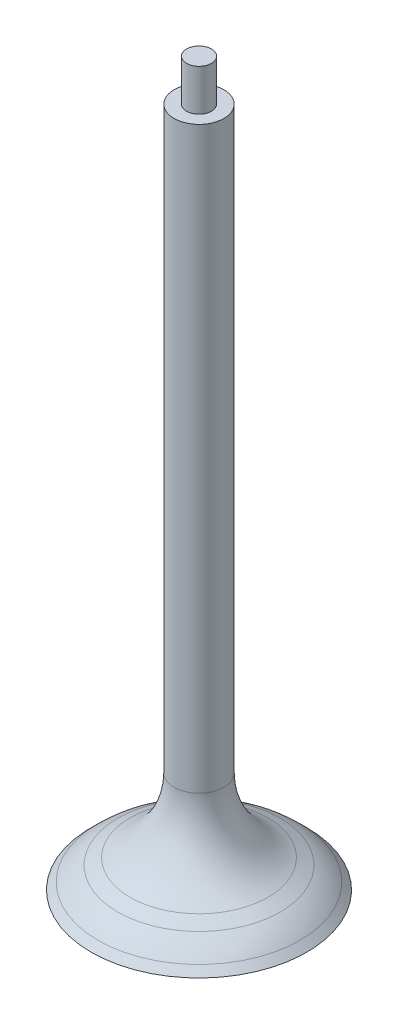
ISO-10303-21;
HEADER;
FILE_DESCRIPTION(('STEP AP214'),'2;1');
FILE_NAME('part.step','',(''),(''),'','','');
FILE_SCHEMA(('AUTOMOTIVE_DESIGN { 1 0 10303 214 1 1 1 1 }'));
ENDSEC;
DATA;
#1=APPLICATION_CONTEXT('core data for automotive mechanical design processes');
#2=APPLICATION_PROTOCOL_DEFINITION('international standard','automotive_design',2000,#1);
#3=PRODUCT_CONTEXT('',#1,'mechanical');
#4=PRODUCT('Part','Part','',(#3));
#5=PRODUCT_RELATED_PRODUCT_CATEGORY('part','',(#4));
#6=PRODUCT_DEFINITION_FORMATION('','',#4);
#7=PRODUCT_DEFINITION_CONTEXT('part definition',#1,'design');
#8=PRODUCT_DEFINITION('design','',#6,#7);
#9=PRODUCT_DEFINITION_SHAPE('','',#8);
#10=(LENGTH_UNIT() NAMED_UNIT(*) SI_UNIT(.MILLI.,.METRE.));
#11=(NAMED_UNIT(*) PLANE_ANGLE_UNIT() SI_UNIT($,.RADIAN.));
#12=(NAMED_UNIT(*) SI_UNIT($,.STERADIAN.) SOLID_ANGLE_UNIT());
#13=UNCERTAINTY_MEASURE_WITH_UNIT(LENGTH_MEASURE(1.E-05),#10,'distance_accuracy_value','');
#14=(GEOMETRIC_REPRESENTATION_CONTEXT(3) GLOBAL_UNCERTAINTY_ASSIGNED_CONTEXT((#13)) GLOBAL_UNIT_ASSIGNED_CONTEXT((#10,
#11,#12)) REPRESENTATION_CONTEXT('',''));
#15=CARTESIAN_POINT('',(0.,0.,0.));
#16=DIRECTION('',(0.,0.,1.));
#17=DIRECTION('',(1.,0.,0.));
#18=AXIS2_PLACEMENT_3D('',#15,#16,#17);
#19=CARTESIAN_POINT('',(13.,0.,0.));
#20=DIRECTION('',(0.,-1.,0.));
#21=DIRECTION('',(0.,0.,-1.));
#22=AXIS2_PLACEMENT_3D('',#19,#20,#21);
#23=PLANE('',#22);
#24=CARTESIAN_POINT('',(0.,0.,0.));
#25=DIRECTION('',(0.,-1.,0.));
#26=DIRECTION('',(0.,0.,-1.));
#27=AXIS2_PLACEMENT_3D('',#24,#25,#26);
#28=CIRCLE('',#27,13.);
#29=CARTESIAN_POINT('',(0.,0.,-13.));
#30=VERTEX_POINT('',#29);
#31=EDGE_CURVE('E62',#30,#30,#28,.T.);
#32=ORIENTED_EDGE('',*,*,#31,.T.);
#33=EDGE_LOOP('',(#32));
#34=FACE_BOUND('',#33,.T.);
#35=ADVANCED_FACE('F33',(#34),#23,.T.);
#36=CARTESIAN_POINT('',(0.,87.,0.));
#37=DIRECTION('',(0.,1.,0.));
#38=DIRECTION('',(0.,0.,1.));
#39=AXIS2_PLACEMENT_3D('',#36,#37,#38);
#40=PLANE('',#39);
#41=CARTESIAN_POINT('',(0.,87.,0.));
#42=DIRECTION('',(0.,-1.,0.));
#43=DIRECTION('',(0.,0.,-1.));
#44=AXIS2_PLACEMENT_3D('',#41,#42,#43);
#45=CIRCLE('',#44,1.5);
#46=CARTESIAN_POINT('',(0.,87.,-1.5));
#47=VERTEX_POINT('',#46);
#48=EDGE_CURVE('E53',#47,#47,#45,.T.);
#49=ORIENTED_EDGE('',*,*,#48,.F.);
#50=EDGE_LOOP('',(#49));
#51=FACE_BOUND('',#50,.T.);
#52=ADVANCED_FACE('F80',(#51),#40,.T.);
#53=CARTESIAN_POINT('',(0.,0.,0.));
#54=DIRECTION('',(0.,-1.,0.));
#55=DIRECTION('',(0.,0.,-1.));
#56=AXIS2_PLACEMENT_3D('',#53,#54,#55);
#57=CYLINDRICAL_SURFACE('',#56,1.5);
#58=ORIENTED_EDGE('',*,*,#48,.T.);
#59=EDGE_LOOP('',(#58));
#60=FACE_BOUND('',#59,.T.);
#61=CARTESIAN_POINT('',(0.,82.,0.));
#62=DIRECTION('',(0.,-1.,0.));
#63=DIRECTION('',(0.,0.,-1.));
#64=AXIS2_PLACEMENT_3D('',#61,#62,#63);
#65=CIRCLE('',#64,1.5);
#66=CARTESIAN_POINT('',(0.,82.,-1.5));
#67=VERTEX_POINT('',#66);
#68=EDGE_CURVE('E56',#67,#67,#65,.T.);
#69=ORIENTED_EDGE('',*,*,#68,.F.);
#70=EDGE_LOOP('',(#69));
#71=FACE_BOUND('',#70,.T.);
#72=ADVANCED_FACE('F85',(#60,#71),#57,.T.);
#73=CARTESIAN_POINT('',(1.5,82.,0.));
#74=DIRECTION('',(0.,1.,0.));
#75=DIRECTION('',(0.,0.,1.));
#76=AXIS2_PLACEMENT_3D('',#73,#74,#75);
#77=PLANE('',#76);
#78=ORIENTED_EDGE('',*,*,#68,.T.);
#79=EDGE_LOOP('',(#78));
#80=FACE_BOUND('',#79,.T.);
#81=CARTESIAN_POINT('',(0.,82.,0.));
#82=DIRECTION('',(0.,-1.,0.));
#83=DIRECTION('',(0.,0.,-1.));
#84=AXIS2_PLACEMENT_3D('',#81,#82,#83);
#85=CIRCLE('',#84,3.);
#86=CARTESIAN_POINT('',(0.,82.,-3.));
#87=VERTEX_POINT('',#86);
#88=EDGE_CURVE('E59',#87,#87,#85,.T.);
#89=ORIENTED_EDGE('',*,*,#88,.F.);
#90=EDGE_LOOP('',(#89));
#91=FACE_BOUND('',#90,.T.);
#92=ADVANCED_FACE('F91',(#80,#91),#77,.T.);
#93=CARTESIAN_POINT('',(0.,0.,0.));
#94=DIRECTION('',(0.,-1.,0.));
#95=DIRECTION('',(0.,0.,-1.));
#96=AXIS2_PLACEMENT_3D('',#93,#94,#95);
#97=CYLINDRICAL_SURFACE('',#96,3.);
#98=CARTESIAN_POINT('',(0.,12.2086061902756,0.));
#99=DIRECTION('',(0.,-1.,0.));
#100=DIRECTION('',(0.,0.,-1.));
#101=AXIS2_PLACEMENT_3D('',#98,#99,#100);
#102=CIRCLE('',#101,3.);
#103=CARTESIAN_POINT('',(0.,12.2086061902756,-3.));
#104=VERTEX_POINT('',#103);
#105=EDGE_CURVE('E44',#104,#104,#102,.F.);
#106=ORIENTED_EDGE('',*,*,#105,.T.);
#107=EDGE_LOOP('',(#106));
#108=FACE_BOUND('',#107,.T.);
#109=ORIENTED_EDGE('',*,*,#88,.T.);
#110=EDGE_LOOP('',(#109));
#111=FACE_BOUND('',#110,.T.);
#112=ADVANCED_FACE('F77',(#108,#111),#97,.T.);
#113=CARTESIAN_POINT('',(0.,1.88538002488021,0.));
#114=DIRECTION('',(0.,-1.,0.));
#115=DIRECTION('',(0.,0.,-1.));
#116=AXIS2_PLACEMENT_3D('',#113,#114,#115);
#117=CONICAL_SURFACE('',#116,11.1146199751198,1.08210413623649);
#118=CARTESIAN_POINT('',(0.,2.58700997651313,0.));
#119=DIRECTION('',(0.,1.,0.));
#120=DIRECTION('',(0.,0.,1.));
#121=AXIS2_PLACEMENT_3D('',#118,#119,#120);
#122=CIRCLE('',#121,9.79504595620407);
#123=CARTESIAN_POINT('',(0.,2.58700997651313,9.79504595620407));
#124=VERTEX_POINT('',#123);
#125=EDGE_CURVE('E10',#124,#124,#122,.T.);
#126=ORIENTED_EDGE('',*,*,#125,.T.);
#127=EDGE_LOOP('',(#126));
#128=FACE_BOUND('',#127,.T.);
#129=CARTESIAN_POINT('',(0.,3.37913026168634,0.));
#130=DIRECTION('',(0.,-1.,0.));
#131=DIRECTION('',(0.,0.,-1.));
#132=AXIS2_PLACEMENT_3D('',#129,#130,#131);
#133=CIRCLE('',#132,8.30528437214112);
#134=CARTESIAN_POINT('',(0.,3.37913026168634,-8.30528437214112));
#135=VERTEX_POINT('',#134);
#136=EDGE_CURVE('E48',#135,#135,#133,.T.);
#137=ORIENTED_EDGE('',*,*,#136,.T.);
#138=EDGE_LOOP('',(#137));
#139=FACE_BOUND('',#138,.T.);
#140=ADVANCED_FACE('F70',(#128,#139),#117,.T.);
#141=CARTESIAN_POINT('',(0.,0.,0.));
#142=DIRECTION('',(0.,-1.,0.));
#143=DIRECTION('',(0.,0.,-1.));
#144=AXIS2_PLACEMENT_3D('',#141,#142,#143);
#145=CONICAL_SURFACE('',#144,13.,0.785398163397451);
#146=CARTESIAN_POINT('',(0.,0.828601859789346,0.));
#147=DIRECTION('',(0.,1.,0.));
#148=DIRECTION('',(0.,0.,1.));
#149=AXIS2_PLACEMENT_3D('',#146,#147,#148);
#150=CIRCLE('',#149,12.1713981402106);
#151=CARTESIAN_POINT('',(0.,0.828601859789346,12.1713981402106));
#152=VERTEX_POINT('',#151);
#153=EDGE_CURVE('E40',#152,#152,#150,.F.);
#154=ORIENTED_EDGE('',*,*,#153,.T.);
#155=EDGE_LOOP('',(#154));
#156=FACE_BOUND('',#155,.T.);
#157=ORIENTED_EDGE('',*,*,#31,.F.);
#158=EDGE_LOOP('',(#157));
#159=FACE_BOUND('',#158,.T.);
#160=ADVANCED_FACE('F67',(#156,#159),#145,.T.);
#161=CARTESIAN_POINT('',(0.,12.2086061902756,0.));
#162=DIRECTION('',(0.,-1.,0.));
#163=DIRECTION('',(0.,0.,-1.));
#164=AXIS2_PLACEMENT_3D('',#161,#162,#163);
#165=TOROIDAL_SURFACE('',#164,13.,10.);
#166=ORIENTED_EDGE('',*,*,#105,.F.);
#167=EDGE_LOOP('',(#166));
#168=FACE_BOUND('',#167,.T.);
#169=ORIENTED_EDGE('',*,*,#136,.F.);
#170=EDGE_LOOP('',(#169));
#171=FACE_BOUND('',#170,.T.);
#172=ADVANCED_FACE('F69',(#168,#171),#165,.F.);
#173=CARTESIAN_POINT('',(0.,-6.24246595207615,0.));
#174=DIRECTION('',(0.,1.,0.));
#175=DIRECTION('',(0.,0.,1.));
#176=AXIS2_PLACEMENT_3D('',#173,#174,#175);
#177=DEGENERATE_TOROIDAL_SURFACE('',#176,5.10033032834519,10.,.T.);
#178=ORIENTED_EDGE('',*,*,#125,.F.);
#179=EDGE_LOOP('',(#178));
#180=FACE_BOUND('',#179,.T.);
#181=ORIENTED_EDGE('',*,*,#153,.F.);
#182=EDGE_LOOP('',(#181));
#183=FACE_BOUND('',#182,.T.);
#184=ADVANCED_FACE('F35',(#180,#183),#177,.T.);
#185=CLOSED_SHELL('',(#35,#52,#72,#92,#112,#140,#160,#172,#184));
#186=MANIFOLD_SOLID_BREP('B2',#185);
#187=ADVANCED_BREP_SHAPE_REPRESENTATION('',(#18,#186),#14);
#188=SHAPE_DEFINITION_REPRESENTATION(#9,#187);
ENDSEC;
END-ISO-10303-21;
